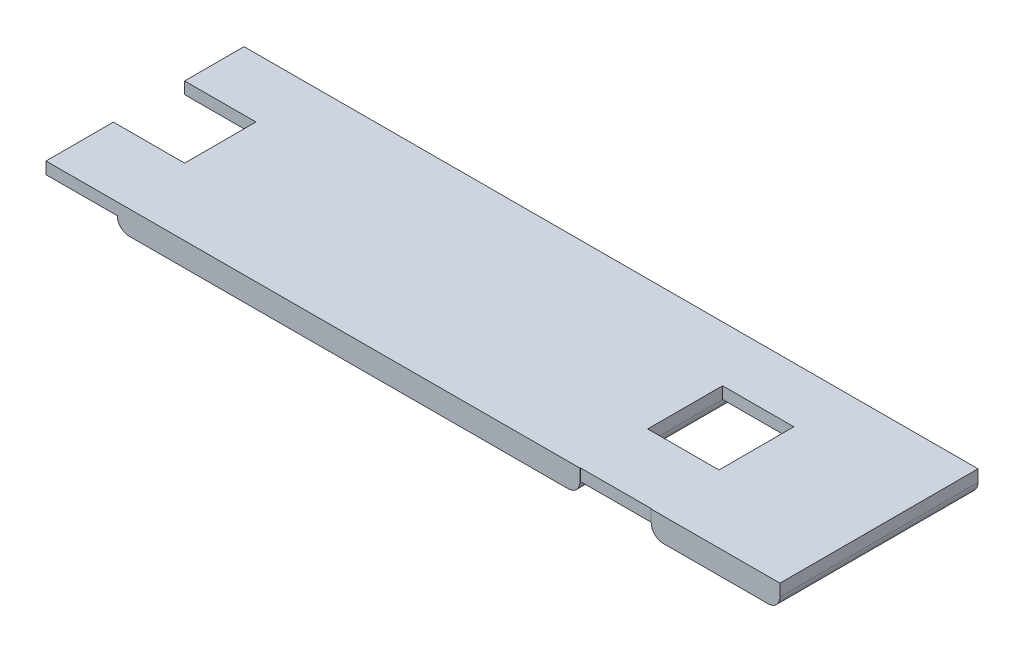
ISO-10303-21;
HEADER;
FILE_DESCRIPTION(('STEP AP214'),'2;1');
FILE_NAME('part.step','',(''),(''),'','','');
FILE_SCHEMA(('AUTOMOTIVE_DESIGN { 1 0 10303 214 1 1 1 1 }'));
ENDSEC;
DATA;
#1=APPLICATION_CONTEXT('core data for automotive mechanical design processes');
#2=APPLICATION_PROTOCOL_DEFINITION('international standard','automotive_design',2000,#1);
#3=PRODUCT_CONTEXT('',#1,'mechanical');
#4=PRODUCT('Part','Part','',(#3));
#5=PRODUCT_RELATED_PRODUCT_CATEGORY('part','',(#4));
#6=PRODUCT_DEFINITION_FORMATION('','',#4);
#7=PRODUCT_DEFINITION_CONTEXT('part definition',#1,'design');
#8=PRODUCT_DEFINITION('design','',#6,#7);
#9=PRODUCT_DEFINITION_SHAPE('','',#8);
#10=(LENGTH_UNIT() NAMED_UNIT(*) SI_UNIT(.MILLI.,.METRE.));
#11=(NAMED_UNIT(*) PLANE_ANGLE_UNIT() SI_UNIT($,.RADIAN.));
#12=(NAMED_UNIT(*) SI_UNIT($,.STERADIAN.) SOLID_ANGLE_UNIT());
#13=UNCERTAINTY_MEASURE_WITH_UNIT(LENGTH_MEASURE(1.E-05),#10,'distance_accuracy_value','');
#14=(GEOMETRIC_REPRESENTATION_CONTEXT(3) GLOBAL_UNCERTAINTY_ASSIGNED_CONTEXT((#13)) GLOBAL_UNIT_ASSIGNED_CONTEXT((#10,
#11,#12)) REPRESENTATION_CONTEXT('',''));
#15=CARTESIAN_POINT('',(0.,0.,0.));
#16=DIRECTION('',(0.,0.,1.));
#17=DIRECTION('',(1.,0.,0.));
#18=AXIS2_PLACEMENT_3D('',#15,#16,#17);
#19=CARTESIAN_POINT('',(-142.327839016119,346.949515418537,-1950.));
#20=DIRECTION('',(0.999998224302538,0.00188451366931833,0.));
#21=DIRECTION('',(-0.00188451366931833,0.999998224302538,0.));
#22=AXIS2_PLACEMENT_3D('',#19,#20,#21);
#23=PLANE('',#22);
#24=DIRECTION('',(-0.0018845136693183,0.999998224302539,0.));
#25=VECTOR('',#24,1.);
#26=CARTESIAN_POINT('',(-142.322185475111,343.94952074563,-1985.));
#27=LINE('',#26,#25);
#28=CARTESIAN_POINT('',(-142.322185475111,343.94952074563,-1985.));
#29=VERTEX_POINT('',#28);
#30=CARTESIAN_POINT('',(-142.327839016119,346.949515418537,-1985.));
#31=VERTEX_POINT('',#30);
#32=EDGE_CURVE('E223',#29,#31,#27,.T.);
#33=ORIENTED_EDGE('',*,*,#32,.F.);
#34=DIRECTION('',(0.,0.,-1.));
#35=VECTOR('',#34,1.);
#36=CARTESIAN_POINT('',(-142.322185475111,343.94952074563,-1950.));
#37=LINE('',#36,#35);
#38=CARTESIAN_POINT('',(-142.322185475111,343.94952074563,-1967.));
#39=VERTEX_POINT('',#38);
#40=EDGE_CURVE('E274',#39,#29,#37,.T.);
#41=ORIENTED_EDGE('',*,*,#40,.F.);
#42=DIRECTION('',(0.0018845136693183,-0.999998224302539,0.));
#43=VECTOR('',#42,1.);
#44=CARTESIAN_POINT('',(-142.327839016119,346.949515418537,-1967.));
#45=LINE('',#44,#43);
#46=CARTESIAN_POINT('',(-142.327839016119,346.949515418537,-1967.));
#47=VERTEX_POINT('',#46);
#48=EDGE_CURVE('E227',#47,#39,#45,.T.);
#49=ORIENTED_EDGE('',*,*,#48,.F.);
#50=DIRECTION('',(0.,0.,-1.));
#51=VECTOR('',#50,1.);
#52=CARTESIAN_POINT('',(-142.327839016119,346.949515418537,-1950.));
#53=LINE('',#52,#51);
#54=EDGE_CURVE('E271',#47,#31,#53,.T.);
#55=ORIENTED_EDGE('',*,*,#54,.T.);
#56=EDGE_LOOP('',(#33,#41,#49,#55));
#57=FACE_BOUND('',#56,.T.);
#58=ADVANCED_FACE('F41',(#57),#23,.F.);
#59=CARTESIAN_POINT('',(-7.53315528742021,347.203538293643,-1950.));
#60=DIRECTION('',(0.999998224302538,0.00188451366931833,0.));
#61=DIRECTION('',(-0.00188451366931833,0.999998224302538,0.));
#62=AXIS2_PLACEMENT_3D('',#59,#60,#61);
#63=PLANE('',#62);
#64=DIRECTION('',(-0.00188451366931833,0.999998224302538,0.));
#65=VECTOR('',#64,1.);
#66=CARTESIAN_POINT('',(-6.87881988214074,-0.0129632531154886,-1986.));
#67=LINE('',#66,#65);
#68=CARTESIAN_POINT('',(-7.52750174641226,344.203543620735,-1986.));
#69=VERTEX_POINT('',#68);
#70=CARTESIAN_POINT('',(-7.53315528742021,347.203538293643,-1986.));
#71=VERTEX_POINT('',#70);
#72=EDGE_CURVE('E61',#69,#71,#67,.T.);
#73=ORIENTED_EDGE('',*,*,#72,.F.);
#74=DIRECTION('',(0.,0.,-1.));
#75=VECTOR('',#74,1.);
#76=CARTESIAN_POINT('',(-7.52750174641226,344.203543620735,-1950.));
#77=LINE('',#76,#75);
#78=CARTESIAN_POINT('',(-7.52750174641226,344.203543620735,-1967.11298419882));
#79=VERTEX_POINT('',#78);
#80=EDGE_CURVE('E356',#79,#69,#77,.T.);
#81=ORIENTED_EDGE('',*,*,#80,.F.);
#82=DIRECTION('',(0.00188451366931833,-0.999998224302538,0.));
#83=VECTOR('',#82,1.);
#84=CARTESIAN_POINT('',(-6.87881988214074,-0.0129632531154886,-1967.11298419882));
#85=LINE('',#84,#83);
#86=CARTESIAN_POINT('',(-7.53315528742021,347.203538293643,-1967.11298419882));
#87=VERTEX_POINT('',#86);
#88=EDGE_CURVE('E311',#87,#79,#85,.T.);
#89=ORIENTED_EDGE('',*,*,#88,.F.);
#90=DIRECTION('',(0.,0.,-1.));
#91=VECTOR('',#90,1.);
#92=CARTESIAN_POINT('',(-7.53315528742021,347.203538293643,-1950.));
#93=LINE('',#92,#91);
#94=EDGE_CURVE('E56',#87,#71,#93,.T.);
#95=ORIENTED_EDGE('',*,*,#94,.T.);
#96=EDGE_LOOP('',(#73,#81,#89,#95));
#97=FACE_BOUND('',#96,.T.);
#98=ADVANCED_FACE('F408',(#97),#63,.F.);
#99=CARTESIAN_POINT('',(-25.5274697838579,344.169622374687,-1950.));
#100=DIRECTION('',(-0.999998224302538,-0.00188451366931833,0.));
#101=DIRECTION('',(0.00188451366931833,-0.999998224302538,0.));
#102=AXIS2_PLACEMENT_3D('',#99,#100,#101);
#103=PLANE('',#102);
#104=DIRECTION('',(-0.00188451366931833,0.999998224302538,0.));
#105=VECTOR('',#104,1.);
#106=CARTESIAN_POINT('',(-24.8787879195864,-0.0468844991632185,-1986.));
#107=LINE('',#106,#105);
#108=CARTESIAN_POINT('',(-25.5274697838579,344.169622374687,-1986.));
#109=VERTEX_POINT('',#108);
#110=CARTESIAN_POINT('',(-25.5331233248659,347.169617047595,-1986.));
#111=VERTEX_POINT('',#110);
#112=EDGE_CURVE('E254',#109,#111,#107,.T.);
#113=ORIENTED_EDGE('',*,*,#112,.T.);
#114=DIRECTION('',(0.,0.,-1.));
#115=VECTOR('',#114,1.);
#116=CARTESIAN_POINT('',(-25.5331233248659,347.169617047595,-1950.));
#117=LINE('',#116,#115);
#118=CARTESIAN_POINT('',(-25.5331233248659,347.169617047595,-1967.11298419882));
#119=VERTEX_POINT('',#118);
#120=EDGE_CURVE('E267',#119,#111,#117,.T.);
#121=ORIENTED_EDGE('',*,*,#120,.F.);
#122=DIRECTION('',(0.00188451366931833,-0.999998224302538,0.));
#123=VECTOR('',#122,1.);
#124=CARTESIAN_POINT('',(-24.8787879195864,-0.0468844991632185,-1967.11298419882));
#125=LINE('',#124,#123);
#126=CARTESIAN_POINT('',(-25.5274697838579,344.169622374687,-1967.11298419882));
#127=VERTEX_POINT('',#126);
#128=EDGE_CURVE('E291',#119,#127,#125,.T.);
#129=ORIENTED_EDGE('',*,*,#128,.T.);
#130=DIRECTION('',(0.,0.,-1.));
#131=VECTOR('',#130,1.);
#132=CARTESIAN_POINT('',(-25.5274697838579,344.169622374687,-1950.));
#133=LINE('',#132,#131);
#134=EDGE_CURVE('E256',#127,#109,#133,.T.);
#135=ORIENTED_EDGE('',*,*,#134,.T.);
#136=EDGE_LOOP('',(#113,#121,#129,#135));
#137=FACE_BOUND('',#136,.T.);
#138=ADVANCED_FACE('F396',(#137),#103,.F.);
#139=CARTESIAN_POINT('',(21.9667870024124,344.259126109747,-1950.));
#140=DIRECTION('',(0.,0.,-1.));
#141=DIRECTION('',(-1.,0.,0.));
#142=AXIS2_PLACEMENT_3D('',#139,#140,#141);
#143=CYLINDRICAL_SURFACE('',#142,3.00000000000001);
#144=CARTESIAN_POINT('',(21.9667870024124,344.259126109747,-2000.));
#145=DIRECTION('',(0.,0.,1.));
#146=DIRECTION('',(1.,0.,0.));
#147=AXIS2_PLACEMENT_3D('',#144,#145,#146);
#148=CIRCLE('',#147,3.00000000000001);
#149=CARTESIAN_POINT('',(21.9724405434203,341.259131436839,-2000.));
#150=VERTEX_POINT('',#149);
#151=CARTESIAN_POINT('',(24.9667870024124,344.259126109747,-2000.));
#152=VERTEX_POINT('',#151);
#153=EDGE_CURVE('E326',#150,#152,#148,.T.);
#154=ORIENTED_EDGE('',*,*,#153,.T.);
#155=DIRECTION('',(0.,0.,-1.));
#156=VECTOR('',#155,1.);
#157=CARTESIAN_POINT('',(24.9667870024124,344.259126109747,-1950.));
#158=LINE('',#157,#156);
#159=CARTESIAN_POINT('',(24.9667870024124,344.259126109747,-1950.));
#160=VERTEX_POINT('',#159);
#161=EDGE_CURVE('E11',#160,#152,#158,.T.);
#162=ORIENTED_EDGE('',*,*,#161,.F.);
#163=CARTESIAN_POINT('',(21.9667870024124,344.259126109747,-1950.));
#164=DIRECTION('',(0.,0.,1.));
#165=DIRECTION('',(1.,0.,0.));
#166=AXIS2_PLACEMENT_3D('',#163,#164,#165);
#167=CIRCLE('',#166,3.00000000000001);
#168=CARTESIAN_POINT('',(21.9724405434203,341.259131436839,-1950.));
#169=VERTEX_POINT('',#168);
#170=EDGE_CURVE('E327',#169,#160,#167,.T.);
#171=ORIENTED_EDGE('',*,*,#170,.F.);
#172=DIRECTION('',(0.,0.,-1.));
#173=VECTOR('',#172,1.);
#174=CARTESIAN_POINT('',(21.9724405434203,341.259131436839,-1950.));
#175=LINE('',#174,#173);
#176=EDGE_CURVE('E341',#169,#150,#175,.T.);
#177=ORIENTED_EDGE('',*,*,#176,.T.);
#178=EDGE_LOOP('',(#154,#162,#171,#177));
#179=FACE_BOUND('',#178,.T.);
#180=ADVANCED_FACE('F43',(#179),#143,.T.);
#181=CARTESIAN_POINT('',(24.9667870024124,344.259126109747,-1950.));
#182=DIRECTION('',(-1.,0.,0.));
#183=DIRECTION('',(0.,0.,1.));
#184=AXIS2_PLACEMENT_3D('',#181,#182,#183);
#185=PLANE('',#184);
#186=DIRECTION('',(0.,1.,0.));
#187=VECTOR('',#186,1.);
#188=CARTESIAN_POINT('',(24.9667870024124,344.259126109747,-2000.));
#189=LINE('',#188,#187);
#190=CARTESIAN_POINT('',(24.9667870024124,347.264784987896,-2000.));
#191=VERTEX_POINT('',#190);
#192=EDGE_CURVE('E344',#152,#191,#189,.T.);
#193=ORIENTED_EDGE('',*,*,#192,.T.);
#194=DIRECTION('',(0.,0.,-1.));
#195=VECTOR('',#194,1.);
#196=CARTESIAN_POINT('',(24.9667870024124,347.264784987896,-1950.));
#197=LINE('',#196,#195);
#198=CARTESIAN_POINT('',(24.9667870024124,347.264784987896,-1950.));
#199=VERTEX_POINT('',#198);
#200=EDGE_CURVE('E49',#199,#191,#197,.T.);
#201=ORIENTED_EDGE('',*,*,#200,.F.);
#202=DIRECTION('',(0.,1.,0.));
#203=VECTOR('',#202,1.);
#204=CARTESIAN_POINT('',(24.9667870024124,344.259126109747,-1950.));
#205=LINE('',#204,#203);
#206=EDGE_CURVE('E330',#160,#199,#205,.T.);
#207=ORIENTED_EDGE('',*,*,#206,.F.);
#208=ORIENTED_EDGE('',*,*,#161,.T.);
#209=EDGE_LOOP('',(#193,#201,#207,#208));
#210=FACE_BOUND('',#209,.T.);
#211=ADVANCED_FACE('F372',(#210),#185,.F.);
#212=CARTESIAN_POINT('',(24.9667870024124,347.264784987896,-1950.));
#213=DIRECTION('',(0.00188451366931463,-0.999998224302538,0.));
#214=DIRECTION('',(0.999998224302538,0.00188451366931463,0.));
#215=AXIS2_PLACEMENT_3D('',#212,#213,#214);
#216=PLANE('',#215);
#217=DIRECTION('',(-0.999998224302538,-0.00188451366931463,0.));
#218=VECTOR('',#217,1.);
#219=CARTESIAN_POINT('',(24.9667870024124,347.264784987896,-2000.));
#220=LINE('',#219,#218);
#221=CARTESIAN_POINT('',(-160.327807053565,346.915594172489,-2000.));
#222=VERTEX_POINT('',#221);
#223=EDGE_CURVE('E346',#191,#222,#220,.T.);
#224=ORIENTED_EDGE('',*,*,#223,.T.);
#225=DIRECTION('',(0.,0.,-1.));
#226=VECTOR('',#225,1.);
#227=CARTESIAN_POINT('',(-160.327807053565,346.915594172489,-2000.));
#228=LINE('',#227,#226);
#229=CARTESIAN_POINT('',(-160.327807053565,346.915594172489,-1985.));
#230=VERTEX_POINT('',#229);
#231=EDGE_CURVE('E197',#230,#222,#228,.T.);
#232=ORIENTED_EDGE('',*,*,#231,.F.);
#233=DIRECTION('',(0.999998224302539,0.00188451366931833,0.));
#234=VECTOR('',#233,1.);
#235=CARTESIAN_POINT('',(-177.590452901906,346.883062422653,-1985.));
#236=LINE('',#235,#234);
#237=EDGE_CURVE('E217',#230,#31,#236,.T.);
#238=ORIENTED_EDGE('',*,*,#237,.T.);
#239=ORIENTED_EDGE('',*,*,#54,.F.);
#240=DIRECTION('',(0.999998224302539,0.00188451366931833,0.));
#241=VECTOR('',#240,1.);
#242=CARTESIAN_POINT('',(-177.590452901906,346.883062422653,-1967.));
#243=LINE('',#242,#241);
#244=CARTESIAN_POINT('',(-160.327807053565,346.915594172489,-1967.));
#245=VERTEX_POINT('',#244);
#246=EDGE_CURVE('E232',#245,#47,#243,.T.);
#247=ORIENTED_EDGE('',*,*,#246,.F.);
#248=DIRECTION('',(0.,0.,-1.));
#249=VECTOR('',#248,1.);
#250=CARTESIAN_POINT('',(-160.327807053565,346.915594172489,-1950.));
#251=LINE('',#250,#249);
#252=CARTESIAN_POINT('',(-160.327807053565,346.915594172489,-1950.));
#253=VERTEX_POINT('',#252);
#254=EDGE_CURVE('E231',#253,#245,#251,.T.);
#255=ORIENTED_EDGE('',*,*,#254,.F.);
#256=DIRECTION('',(-0.999998224302539,-0.00188451366931599,0.));
#257=VECTOR('',#256,1.);
#258=CARTESIAN_POINT('',(-25.5331233248659,347.169617047595,-1950.));
#259=LINE('',#258,#257);
#260=CARTESIAN_POINT('',(-25.5331233248659,347.169617047595,-1950.));
#261=VERTEX_POINT('',#260);
#262=EDGE_CURVE('E295',#261,#253,#259,.T.);
#263=ORIENTED_EDGE('',*,*,#262,.F.);
#264=CARTESIAN_POINT('',(-25.5331233248659,347.169617047595,-1950.11298419882));
#265=VERTEX_POINT('',#264);
#266=EDGE_CURVE('E268',#261,#265,#117,.T.);
#267=ORIENTED_EDGE('',*,*,#266,.T.);
#268=DIRECTION('',(0.999998224302539,0.00188451366931833,0.));
#269=VECTOR('',#268,1.);
#270=CARTESIAN_POINT('',(-42.795769173207,347.137085297759,-1950.11298419882));
#271=LINE('',#270,#269);
#272=CARTESIAN_POINT('',(-7.53315528742021,347.203538293643,-1950.11298419882));
#273=VERTEX_POINT('',#272);
#274=EDGE_CURVE('E313',#265,#273,#271,.T.);
#275=ORIENTED_EDGE('',*,*,#274,.T.);
#276=CARTESIAN_POINT('',(-7.53315528742021,347.203538293643,-1950.));
#277=VERTEX_POINT('',#276);
#278=EDGE_CURVE('E360',#277,#273,#93,.T.);
#279=ORIENTED_EDGE('',*,*,#278,.F.);
#280=DIRECTION('',(-0.999998224302538,-0.00188451366931463,0.));
#281=VECTOR('',#280,1.);
#282=CARTESIAN_POINT('',(24.9667870024124,347.264784987896,-1950.));
#283=LINE('',#282,#281);
#284=EDGE_CURVE('E333',#199,#277,#283,.T.);
#285=ORIENTED_EDGE('',*,*,#284,.F.);
#286=ORIENTED_EDGE('',*,*,#200,.T.);
#287=EDGE_LOOP('',(#224,#232,#238,#239,#247,#255,#263,#267,#275,#279,#285,#286));
#288=FACE_BOUND('',#287,.T.);
#289=DIRECTION('',(0.999998224302539,0.00188451366931833,0.));
#290=VECTOR('',#289,1.);
#291=CARTESIAN_POINT('',(-42.795769173207,347.137085297759,-1986.));
#292=LINE('',#291,#290);
#293=EDGE_CURVE('E249',#111,#71,#292,.T.);
#294=ORIENTED_EDGE('',*,*,#293,.T.);
#295=ORIENTED_EDGE('',*,*,#94,.F.);
#296=DIRECTION('',(0.999998224302539,0.00188451366931833,0.));
#297=VECTOR('',#296,1.);
#298=CARTESIAN_POINT('',(-42.795769173207,347.137085297759,-1967.11298419882));
#299=LINE('',#298,#297);
#300=EDGE_CURVE('E309',#119,#87,#299,.T.);
#301=ORIENTED_EDGE('',*,*,#300,.F.);
#302=ORIENTED_EDGE('',*,*,#120,.T.);
#303=EDGE_LOOP('',(#294,#295,#301,#302));
#304=FACE_BOUND('',#303,.T.);
#305=ADVANCED_FACE('F366',(#288,#304),#216,.F.);
#306=ORIENTED_EDGE('',*,*,#278,.T.);
#307=DIRECTION('',(0.00188451366931833,-0.999998224302538,0.));
#308=VECTOR('',#307,1.);
#309=CARTESIAN_POINT('',(-6.87881988214074,-0.0129632531154886,-1950.11298419882));
#310=LINE('',#309,#308);
#311=CARTESIAN_POINT('',(-7.52750174641226,344.203543620735,-1950.11298419882));
#312=VERTEX_POINT('',#311);
#313=EDGE_CURVE('E301',#273,#312,#310,.T.);
#314=ORIENTED_EDGE('',*,*,#313,.T.);
#315=CARTESIAN_POINT('',(-7.52750174641226,344.203543620735,-1950.));
#316=VERTEX_POINT('',#315);
#317=EDGE_CURVE('E357',#316,#312,#77,.T.);
#318=ORIENTED_EDGE('',*,*,#317,.F.);
#319=DIRECTION('',(0.00188451366931833,-0.999998224302538,0.));
#320=VECTOR('',#319,1.);
#321=CARTESIAN_POINT('',(-7.53315528742021,347.203538293643,-1950.));
#322=LINE('',#321,#320);
#323=EDGE_CURVE('E335',#277,#316,#322,.T.);
#324=ORIENTED_EDGE('',*,*,#323,.F.);
#325=EDGE_LOOP('',(#306,#314,#318,#324));
#326=FACE_BOUND('',#325,.T.);
#327=ADVANCED_FACE('F413',(#326),#63,.F.);
#328=CARTESIAN_POINT('',(-4.52750707350463,344.209197161743,-1950.));
#329=DIRECTION('',(0.,0.,-1.));
#330=DIRECTION('',(-1.,0.,0.));
#331=AXIS2_PLACEMENT_3D('',#328,#329,#330);
#332=CYLINDRICAL_SURFACE('',#331,3.00000000000001);
#333=CARTESIAN_POINT('',(-4.52750707350463,344.209197161743,-2000.));
#334=DIRECTION('',(0.,0.,1.));
#335=DIRECTION('',(1.,0.,0.));
#336=AXIS2_PLACEMENT_3D('',#333,#334,#335);
#337=CIRCLE('',#336,3.00000000000001);
#338=CARTESIAN_POINT('',(-7.52750174641226,344.203543620735,-2000.));
#339=VERTEX_POINT('',#338);
#340=CARTESIAN_POINT('',(-4.52185353249668,341.209202488836,-2000.));
#341=VERTEX_POINT('',#340);
#342=EDGE_CURVE('E348',#339,#341,#337,.T.);
#343=ORIENTED_EDGE('',*,*,#342,.T.);
#344=DIRECTION('',(0.,0.,-1.));
#345=VECTOR('',#344,1.);
#346=CARTESIAN_POINT('',(-4.52185353249668,341.209202488836,-1950.));
#347=LINE('',#346,#345);
#348=CARTESIAN_POINT('',(-4.52185353249668,341.209202488836,-1950.));
#349=VERTEX_POINT('',#348);
#350=EDGE_CURVE('E353',#349,#341,#347,.T.);
#351=ORIENTED_EDGE('',*,*,#350,.F.);
#352=CARTESIAN_POINT('',(-4.52750707350463,344.209197161743,-1950.));
#353=DIRECTION('',(0.,0.,1.));
#354=DIRECTION('',(1.,0.,0.));
#355=AXIS2_PLACEMENT_3D('',#352,#353,#354);
#356=CIRCLE('',#355,3.00000000000001);
#357=EDGE_CURVE('E337',#316,#349,#356,.T.);
#358=ORIENTED_EDGE('',*,*,#357,.F.);
#359=ORIENTED_EDGE('',*,*,#317,.T.);
#360=DIRECTION('',(0.,0.,1.));
#361=VECTOR('',#360,1.);
#362=CARTESIAN_POINT('',(-7.52750174641227,344.203543620735,0.));
#363=LINE('',#362,#361);
#364=EDGE_CURVE('E306',#79,#312,#363,.T.);
#365=ORIENTED_EDGE('',*,*,#364,.F.);
#366=ORIENTED_EDGE('',*,*,#80,.T.);
#367=DIRECTION('',(0.,0.,1.));
#368=VECTOR('',#367,1.);
#369=CARTESIAN_POINT('',(-7.52750174641227,344.203543620735,0.));
#370=LINE('',#369,#368);
#371=EDGE_CURVE('E251',#339,#69,#370,.T.);
#372=ORIENTED_EDGE('',*,*,#371,.F.);
#373=EDGE_LOOP('',(#343,#351,#358,#359,#365,#366,#372));
#374=FACE_BOUND('',#373,.T.);
#375=ADVANCED_FACE('F385',(#374),#332,.T.);
#376=CARTESIAN_POINT('',(-4.52185353249668,341.209202488836,-1950.));
#377=DIRECTION('',(-0.00188451366931401,0.999998224302538,0.));
#378=DIRECTION('',(-0.999998224302538,-0.00188451366931401,0.));
#379=AXIS2_PLACEMENT_3D('',#376,#377,#378);
#380=PLANE('',#379);
#381=DIRECTION('',(0.999998224302538,0.00188451366931401,0.));
#382=VECTOR('',#381,1.);
#383=CARTESIAN_POINT('',(-4.52185353249668,341.209202488836,-2000.));
#384=LINE('',#383,#382);
#385=EDGE_CURVE('E331',#341,#150,#384,.T.);
#386=ORIENTED_EDGE('',*,*,#385,.T.);
#387=ORIENTED_EDGE('',*,*,#176,.F.);
#388=DIRECTION('',(0.999998224302538,0.00188451366931401,0.));
#389=VECTOR('',#388,1.);
#390=CARTESIAN_POINT('',(-4.52185353249668,341.209202488836,-1950.));
#391=LINE('',#390,#389);
#392=EDGE_CURVE('E339',#349,#169,#391,.T.);
#393=ORIENTED_EDGE('',*,*,#392,.F.);
#394=ORIENTED_EDGE('',*,*,#350,.T.);
#395=EDGE_LOOP('',(#386,#387,#393,#394));
#396=FACE_BOUND('',#395,.T.);
#397=ADVANCED_FACE('F378',(#396),#380,.F.);
#398=CARTESIAN_POINT('',(21.9667870024124,344.259126109747,-1950.));
#399=DIRECTION('',(0.,0.,1.));
#400=DIRECTION('',(1.,0.,0.));
#401=AXIS2_PLACEMENT_3D('',#398,#399,#400);
#402=PLANE('',#401);
#403=ORIENTED_EDGE('',*,*,#170,.T.);
#404=ORIENTED_EDGE('',*,*,#206,.T.);
#405=ORIENTED_EDGE('',*,*,#284,.T.);
#406=ORIENTED_EDGE('',*,*,#323,.T.);
#407=ORIENTED_EDGE('',*,*,#357,.T.);
#408=ORIENTED_EDGE('',*,*,#392,.T.);
#409=EDGE_LOOP('',(#403,#404,#405,#406,#407,#408));
#410=FACE_BOUND('',#409,.T.);
#411=ADVANCED_FACE('F487',(#410),#402,.T.);
#412=CARTESIAN_POINT('',(21.9667870024124,344.259126109747,-2000.));
#413=DIRECTION('',(0.,0.,1.));
#414=DIRECTION('',(1.,0.,0.));
#415=AXIS2_PLACEMENT_3D('',#412,#413,#414);
#416=PLANE('',#415);
#417=ORIENTED_EDGE('',*,*,#153,.F.);
#418=ORIENTED_EDGE('',*,*,#385,.F.);
#419=ORIENTED_EDGE('',*,*,#342,.F.);
#420=DIRECTION('',(0.999998224302539,0.00188451366931833,0.));
#421=VECTOR('',#420,1.);
#422=CARTESIAN_POINT('',(-42.7901156321991,344.137090624851,-2000.));
#423=LINE('',#422,#421);
#424=CARTESIAN_POINT('',(-25.5274697838579,344.169622374687,-2000.));
#425=VERTEX_POINT('',#424);
#426=EDGE_CURVE('E247',#425,#339,#423,.T.);
#427=ORIENTED_EDGE('',*,*,#426,.F.);
#428=CARTESIAN_POINT('',(-28.5274644567656,344.16396883368,-2000.));
#429=DIRECTION('',(0.,0.,1.));
#430=DIRECTION('',(1.,0.,0.));
#431=AXIS2_PLACEMENT_3D('',#428,#429,#430);
#432=CIRCLE('',#431,3.00000000000001);
#433=CARTESIAN_POINT('',(-28.5218109157576,341.163974160772,-2000.));
#434=VERTEX_POINT('',#433);
#435=EDGE_CURVE('E289',#434,#425,#432,.T.);
#436=ORIENTED_EDGE('',*,*,#435,.F.);
#437=DIRECTION('',(0.999998224302538,0.00188451366931586,0.));
#438=VECTOR('',#437,1.);
#439=CARTESIAN_POINT('',(-139.316537261196,340.95517961373,-2000.));
#440=LINE('',#439,#438);
#441=CARTESIAN_POINT('',(-139.316537261196,340.95517961373,-2000.));
#442=VERTEX_POINT('',#441);
#443=EDGE_CURVE('E285',#442,#434,#440,.T.);
#444=ORIENTED_EDGE('',*,*,#443,.F.);
#445=CARTESIAN_POINT('',(-139.322190802203,343.955174286638,-2000.));
#446=DIRECTION('',(0.,0.,1.));
#447=DIRECTION('',(1.,0.,0.));
#448=AXIS2_PLACEMENT_3D('',#445,#446,#447);
#449=CIRCLE('',#448,3.00000000000001);
#450=CARTESIAN_POINT('',(-142.322185475111,343.94952074563,-2000.));
#451=VERTEX_POINT('',#450);
#452=EDGE_CURVE('E215',#451,#442,#449,.T.);
#453=ORIENTED_EDGE('',*,*,#452,.F.);
#454=DIRECTION('',(0.999998224302539,0.00188451366931833,0.));
#455=VECTOR('',#454,1.);
#456=CARTESIAN_POINT('',(-177.584799360898,343.883067749745,-2000.));
#457=LINE('',#456,#455);
#458=CARTESIAN_POINT('',(-160.322153512557,343.915599499582,-2000.));
#459=VERTEX_POINT('',#458);
#460=EDGE_CURVE('E206',#459,#451,#457,.T.);
#461=ORIENTED_EDGE('',*,*,#460,.F.);
#462=DIRECTION('',(0.00188451366931581,-0.999998224302539,0.));
#463=VECTOR('',#462,1.);
#464=CARTESIAN_POINT('',(-160.322153512557,343.915599499582,-2000.));
#465=LINE('',#464,#463);
#466=EDGE_CURVE('E191',#222,#459,#465,.T.);
#467=ORIENTED_EDGE('',*,*,#466,.F.);
#468=ORIENTED_EDGE('',*,*,#223,.F.);
#469=ORIENTED_EDGE('',*,*,#192,.F.);
#470=EDGE_LOOP('',(#417,#418,#419,#427,#436,#444,#453,#461,#467,#468,#469));
#471=FACE_BOUND('',#470,.T.);
#472=ADVANCED_FACE('F213',(#471),#416,.F.);
#473=CARTESIAN_POINT('',(-42.1414337679276,-0.0794162489995643,-1950.11298419882));
#474=DIRECTION('',(0.,0.,1.));
#475=DIRECTION('',(1.,0.,0.));
#476=AXIS2_PLACEMENT_3D('',#473,#474,#475);
#477=PLANE('',#476);
#478=ORIENTED_EDGE('',*,*,#274,.F.);
#479=DIRECTION('',(0.00188451366931833,-0.999998224302538,0.));
#480=VECTOR('',#479,1.);
#481=CARTESIAN_POINT('',(-24.8787879195864,-0.0468844991632185,-1950.11298419882));
#482=LINE('',#481,#480);
#483=CARTESIAN_POINT('',(-25.5274697838579,344.169622374687,-1950.11298419882));
#484=VERTEX_POINT('',#483);
#485=EDGE_CURVE('E304',#265,#484,#482,.T.);
#486=ORIENTED_EDGE('',*,*,#485,.T.);
#487=DIRECTION('',(0.999998224302539,0.00188451366931833,0.));
#488=VECTOR('',#487,1.);
#489=CARTESIAN_POINT('',(-42.7901156321991,344.137090624851,-1950.11298419882));
#490=LINE('',#489,#488);
#491=EDGE_CURVE('E316',#484,#312,#490,.T.);
#492=ORIENTED_EDGE('',*,*,#491,.T.);
#493=ORIENTED_EDGE('',*,*,#313,.F.);
#494=EDGE_LOOP('',(#478,#486,#492,#493));
#495=FACE_BOUND('',#494,.T.);
#496=ADVANCED_FACE('F416',(#495),#477,.T.);
#497=CARTESIAN_POINT('',(-42.7901156321991,344.137090624851,0.));
#498=DIRECTION('',(-0.00188451366931833,0.999998224302539,0.));
#499=DIRECTION('',(-0.999998224302539,-0.00188451366931833,0.));
#500=AXIS2_PLACEMENT_3D('',#497,#498,#499);
#501=PLANE('',#500);
#502=DIRECTION('',(0.,0.,1.));
#503=VECTOR('',#502,1.);
#504=CARTESIAN_POINT('',(-25.5274697838579,344.169622374687,0.));
#505=LINE('',#504,#503);
#506=EDGE_CURVE('E305',#127,#484,#505,.T.);
#507=ORIENTED_EDGE('',*,*,#506,.F.);
#508=DIRECTION('',(0.999998224302539,0.00188451366931833,0.));
#509=VECTOR('',#508,1.);
#510=CARTESIAN_POINT('',(-42.7901156321991,344.137090624851,-1967.11298419882));
#511=LINE('',#510,#509);
#512=EDGE_CURVE('E310',#127,#79,#511,.T.);
#513=ORIENTED_EDGE('',*,*,#512,.T.);
#514=ORIENTED_EDGE('',*,*,#364,.T.);
#515=ORIENTED_EDGE('',*,*,#491,.F.);
#516=EDGE_LOOP('',(#507,#513,#514,#515));
#517=FACE_BOUND('',#516,.T.);
#518=ADVANCED_FACE('F407',(#517),#501,.F.);
#519=CARTESIAN_POINT('',(-42.1414337679276,-0.0794162489995643,-1967.11298419882));
#520=DIRECTION('',(0.,0.,1.));
#521=DIRECTION('',(1.,0.,0.));
#522=AXIS2_PLACEMENT_3D('',#519,#520,#521);
#523=PLANE('',#522);
#524=ORIENTED_EDGE('',*,*,#128,.F.);
#525=ORIENTED_EDGE('',*,*,#300,.T.);
#526=ORIENTED_EDGE('',*,*,#88,.T.);
#527=ORIENTED_EDGE('',*,*,#512,.F.);
#528=EDGE_LOOP('',(#524,#525,#526,#527));
#529=FACE_BOUND('',#528,.T.);
#530=ADVANCED_FACE('F405',(#529),#523,.F.);
#531=CARTESIAN_POINT('',(-28.5274644567656,344.16396883368,-1950.));
#532=DIRECTION('',(0.,0.,-1.));
#533=DIRECTION('',(-1.,0.,0.));
#534=AXIS2_PLACEMENT_3D('',#531,#532,#533);
#535=CYLINDRICAL_SURFACE('',#534,3.00000000000001);
#536=ORIENTED_EDGE('',*,*,#435,.T.);
#537=DIRECTION('',(0.,0.,1.));
#538=VECTOR('',#537,1.);
#539=CARTESIAN_POINT('',(-25.5274697838579,344.169622374687,0.));
#540=LINE('',#539,#538);
#541=EDGE_CURVE('E257',#425,#109,#540,.T.);
#542=ORIENTED_EDGE('',*,*,#541,.T.);
#543=ORIENTED_EDGE('',*,*,#134,.F.);
#544=ORIENTED_EDGE('',*,*,#506,.T.);
#545=CARTESIAN_POINT('',(-25.5274697838579,344.169622374687,-1950.));
#546=VERTEX_POINT('',#545);
#547=EDGE_CURVE('E264',#546,#484,#133,.T.);
#548=ORIENTED_EDGE('',*,*,#547,.F.);
#549=CARTESIAN_POINT('',(-28.5274644567656,344.16396883368,-1950.));
#550=DIRECTION('',(0.,0.,1.));
#551=DIRECTION('',(1.,0.,0.));
#552=AXIS2_PLACEMENT_3D('',#549,#550,#551);
#553=CIRCLE('',#552,3.00000000000001);
#554=CARTESIAN_POINT('',(-28.5218109157576,341.163974160772,-1950.));
#555=VERTEX_POINT('',#554);
#556=EDGE_CURVE('E287',#555,#546,#553,.T.);
#557=ORIENTED_EDGE('',*,*,#556,.F.);
#558=DIRECTION('',(0.,0.,-1.));
#559=VECTOR('',#558,1.);
#560=CARTESIAN_POINT('',(-28.5218109157576,341.163974160772,-1950.));
#561=LINE('',#560,#559);
#562=EDGE_CURVE('E281',#555,#434,#561,.T.);
#563=ORIENTED_EDGE('',*,*,#562,.T.);
#564=EDGE_LOOP('',(#536,#542,#543,#544,#548,#557,#563));
#565=FACE_BOUND('',#564,.T.);
#566=ADVANCED_FACE('F393',(#565),#535,.T.);
#567=ORIENTED_EDGE('',*,*,#485,.F.);
#568=ORIENTED_EDGE('',*,*,#266,.F.);
#569=DIRECTION('',(-0.00188451366931833,0.999998224302538,0.));
#570=VECTOR('',#569,1.);
#571=CARTESIAN_POINT('',(-25.5274697838579,344.169622374687,-1950.));
#572=LINE('',#571,#570);
#573=EDGE_CURVE('E297',#546,#261,#572,.T.);
#574=ORIENTED_EDGE('',*,*,#573,.F.);
#575=ORIENTED_EDGE('',*,*,#547,.T.);
#576=EDGE_LOOP('',(#567,#568,#574,#575));
#577=FACE_BOUND('',#576,.T.);
#578=ADVANCED_FACE('F422',(#577),#103,.F.);
#579=CARTESIAN_POINT('',(-139.322190802203,343.955174286638,-1950.));
#580=DIRECTION('',(0.,0.,-1.));
#581=DIRECTION('',(-1.,0.,0.));
#582=AXIS2_PLACEMENT_3D('',#579,#580,#581);
#583=CYLINDRICAL_SURFACE('',#582,3.00000000000001);
#584=ORIENTED_EDGE('',*,*,#452,.T.);
#585=DIRECTION('',(0.,0.,-1.));
#586=VECTOR('',#585,1.);
#587=CARTESIAN_POINT('',(-139.316537261196,340.95517961373,-1950.));
#588=LINE('',#587,#586);
#589=CARTESIAN_POINT('',(-139.316537261196,340.95517961373,-1950.));
#590=VERTEX_POINT('',#589);
#591=EDGE_CURVE('E278',#590,#442,#588,.T.);
#592=ORIENTED_EDGE('',*,*,#591,.F.);
#593=CARTESIAN_POINT('',(-139.322190802203,343.955174286638,-1950.));
#594=DIRECTION('',(0.,0.,1.));
#595=DIRECTION('',(1.,0.,0.));
#596=AXIS2_PLACEMENT_3D('',#593,#594,#595);
#597=CIRCLE('',#596,3.00000000000001);
#598=CARTESIAN_POINT('',(-142.322185475111,343.94952074563,-1950.));
#599=VERTEX_POINT('',#598);
#600=EDGE_CURVE('E293',#599,#590,#597,.T.);
#601=ORIENTED_EDGE('',*,*,#600,.F.);
#602=EDGE_CURVE('E275',#599,#39,#37,.T.);
#603=ORIENTED_EDGE('',*,*,#602,.T.);
#604=ORIENTED_EDGE('',*,*,#40,.T.);
#605=DIRECTION('',(0.,0.,1.));
#606=VECTOR('',#605,1.);
#607=CARTESIAN_POINT('',(-142.322185475111,343.94952074563,-2000.));
#608=LINE('',#607,#606);
#609=EDGE_CURVE('E226',#451,#29,#608,.T.);
#610=ORIENTED_EDGE('',*,*,#609,.F.);
#611=EDGE_LOOP('',(#584,#592,#601,#603,#604,#610));
#612=FACE_BOUND('',#611,.T.);
#613=ADVANCED_FACE('F433',(#612),#583,.T.);
#614=CARTESIAN_POINT('',(-139.316537261196,340.95517961373,-1950.));
#615=DIRECTION('',(-0.00188451366931586,0.999998224302538,0.));
#616=DIRECTION('',(-0.999998224302538,-0.00188451366931586,0.));
#617=AXIS2_PLACEMENT_3D('',#614,#615,#616);
#618=PLANE('',#617);
#619=ORIENTED_EDGE('',*,*,#443,.T.);
#620=ORIENTED_EDGE('',*,*,#562,.F.);
#621=DIRECTION('',(0.999998224302538,0.00188451366931586,0.));
#622=VECTOR('',#621,1.);
#623=CARTESIAN_POINT('',(-139.316537261196,340.95517961373,-1950.));
#624=LINE('',#623,#622);
#625=EDGE_CURVE('E284',#590,#555,#624,.T.);
#626=ORIENTED_EDGE('',*,*,#625,.F.);
#627=ORIENTED_EDGE('',*,*,#591,.T.);
#628=EDGE_LOOP('',(#619,#620,#626,#627));
#629=FACE_BOUND('',#628,.T.);
#630=ADVANCED_FACE('F429',(#629),#618,.F.);
#631=CARTESIAN_POINT('',(-28.5274644567656,344.16396883368,-1950.));
#632=DIRECTION('',(0.,0.,1.));
#633=DIRECTION('',(1.,0.,0.));
#634=AXIS2_PLACEMENT_3D('',#631,#632,#633);
#635=PLANE('',#634);
#636=ORIENTED_EDGE('',*,*,#556,.T.);
#637=ORIENTED_EDGE('',*,*,#573,.T.);
#638=ORIENTED_EDGE('',*,*,#262,.T.);
#639=DIRECTION('',(-0.00188451366931581,0.999998224302539,0.));
#640=VECTOR('',#639,1.);
#641=CARTESIAN_POINT('',(-160.327807053565,346.915594172489,-1950.));
#642=LINE('',#641,#640);
#643=CARTESIAN_POINT('',(-160.322153512557,343.915599499582,-1950.));
#644=VERTEX_POINT('',#643);
#645=EDGE_CURVE('E234',#644,#253,#642,.T.);
#646=ORIENTED_EDGE('',*,*,#645,.F.);
#647=DIRECTION('',(0.999998224302539,0.00188451366931833,0.));
#648=VECTOR('',#647,1.);
#649=CARTESIAN_POINT('',(-177.584799360898,343.883067749745,-1950.));
#650=LINE('',#649,#648);
#651=EDGE_CURVE('E240',#644,#599,#650,.T.);
#652=ORIENTED_EDGE('',*,*,#651,.T.);
#653=ORIENTED_EDGE('',*,*,#600,.T.);
#654=ORIENTED_EDGE('',*,*,#625,.T.);
#655=EDGE_LOOP('',(#636,#637,#638,#646,#652,#653,#654));
#656=FACE_BOUND('',#655,.T.);
#657=ADVANCED_FACE('F425',(#656),#635,.T.);
#658=CARTESIAN_POINT('',(-42.7901156321991,344.137090624851,0.));
#659=DIRECTION('',(-0.00188451366931833,0.999998224302539,0.));
#660=DIRECTION('',(-0.999998224302539,-0.00188451366931833,0.));
#661=AXIS2_PLACEMENT_3D('',#658,#659,#660);
#662=PLANE('',#661);
#663=ORIENTED_EDGE('',*,*,#541,.F.);
#664=ORIENTED_EDGE('',*,*,#426,.T.);
#665=ORIENTED_EDGE('',*,*,#371,.T.);
#666=DIRECTION('',(0.999998224302539,0.00188451366931833,0.));
#667=VECTOR('',#666,1.);
#668=CARTESIAN_POINT('',(-42.7901156321991,344.137090624851,-1986.));
#669=LINE('',#668,#667);
#670=EDGE_CURVE('E250',#109,#69,#669,.T.);
#671=ORIENTED_EDGE('',*,*,#670,.F.);
#672=EDGE_LOOP('',(#663,#664,#665,#671));
#673=FACE_BOUND('',#672,.T.);
#674=ADVANCED_FACE('F389',(#673),#662,.F.);
#675=CARTESIAN_POINT('',(-42.1414337679276,-0.0794162489995643,-1986.));
#676=DIRECTION('',(0.,0.,-1.));
#677=DIRECTION('',(-1.,0.,0.));
#678=AXIS2_PLACEMENT_3D('',#675,#676,#677);
#679=PLANE('',#678);
#680=ORIENTED_EDGE('',*,*,#112,.F.);
#681=ORIENTED_EDGE('',*,*,#670,.T.);
#682=ORIENTED_EDGE('',*,*,#72,.T.);
#683=ORIENTED_EDGE('',*,*,#293,.F.);
#684=EDGE_LOOP('',(#680,#681,#682,#683));
#685=FACE_BOUND('',#684,.T.);
#686=ADVANCED_FACE('F402',(#685),#679,.F.);
#687=CARTESIAN_POINT('',(-177.590452901906,346.883062422653,-1967.));
#688=DIRECTION('',(0.,0.,1.));
#689=DIRECTION('',(1.,0.,0.));
#690=AXIS2_PLACEMENT_3D('',#687,#688,#689);
#691=PLANE('',#690);
#692=DIRECTION('',(0.00188451366931581,-0.999998224302539,0.));
#693=VECTOR('',#692,1.);
#694=CARTESIAN_POINT('',(-160.327807053565,346.915594172489,-1967.));
#695=LINE('',#694,#693);
#696=CARTESIAN_POINT('',(-160.322153512557,343.915599499582,-1967.));
#697=VERTEX_POINT('',#696);
#698=EDGE_CURVE('E229',#245,#697,#695,.T.);
#699=ORIENTED_EDGE('',*,*,#698,.F.);
#700=ORIENTED_EDGE('',*,*,#246,.T.);
#701=ORIENTED_EDGE('',*,*,#48,.T.);
#702=DIRECTION('',(0.999998224302539,0.00188451366931833,0.));
#703=VECTOR('',#702,1.);
#704=CARTESIAN_POINT('',(-177.584799360898,343.883067749745,-1967.));
#705=LINE('',#704,#703);
#706=EDGE_CURVE('E243',#697,#39,#705,.T.);
#707=ORIENTED_EDGE('',*,*,#706,.F.);
#708=EDGE_LOOP('',(#699,#700,#701,#707));
#709=FACE_BOUND('',#708,.T.);
#710=ADVANCED_FACE('F447',(#709),#691,.F.);
#711=CARTESIAN_POINT('',(-177.584799360898,343.883067749745,-1950.));
#712=DIRECTION('',(-0.00188451366931833,0.999998224302539,0.));
#713=DIRECTION('',(-0.999998224302539,-0.00188451366931833,0.));
#714=AXIS2_PLACEMENT_3D('',#711,#712,#713);
#715=PLANE('',#714);
#716=DIRECTION('',(0.,0.,1.));
#717=VECTOR('',#716,1.);
#718=CARTESIAN_POINT('',(-160.322153512557,343.915599499582,-1950.));
#719=LINE('',#718,#717);
#720=EDGE_CURVE('E237',#697,#644,#719,.T.);
#721=ORIENTED_EDGE('',*,*,#720,.F.);
#722=ORIENTED_EDGE('',*,*,#706,.T.);
#723=ORIENTED_EDGE('',*,*,#602,.F.);
#724=ORIENTED_EDGE('',*,*,#651,.F.);
#725=EDGE_LOOP('',(#721,#722,#723,#724));
#726=FACE_BOUND('',#725,.T.);
#727=ADVANCED_FACE('F455',(#726),#715,.F.);
#728=CARTESIAN_POINT('',(-159.552523431166,-64.4808622993229,-1949.96));
#729=DIRECTION('',(-0.999998224302539,-0.00188451366931581,0.));
#730=DIRECTION('',(0.,0.,1.));
#731=AXIS2_PLACEMENT_3D('',#728,#729,#730);
#732=PLANE('',#731);
#733=ORIENTED_EDGE('',*,*,#645,.T.);
#734=ORIENTED_EDGE('',*,*,#254,.T.);
#735=ORIENTED_EDGE('',*,*,#698,.T.);
#736=ORIENTED_EDGE('',*,*,#720,.T.);
#737=EDGE_LOOP('',(#733,#734,#735,#736));
#738=FACE_BOUND('',#737,.T.);
#739=ADVANCED_FACE('F451',(#738),#732,.T.);
#740=CARTESIAN_POINT('',(-177.584799360898,343.883067749745,-2000.));
#741=DIRECTION('',(-0.00188451366931833,0.999998224302539,0.));
#742=DIRECTION('',(-0.999998224302539,-0.00188451366931833,0.));
#743=AXIS2_PLACEMENT_3D('',#740,#741,#742);
#744=PLANE('',#743);
#745=DIRECTION('',(0.,0.,1.));
#746=VECTOR('',#745,1.);
#747=CARTESIAN_POINT('',(-160.322153512557,343.915599499582,-2000.));
#748=LINE('',#747,#746);
#749=CARTESIAN_POINT('',(-160.322153512557,343.915599499582,-1985.));
#750=VERTEX_POINT('',#749);
#751=EDGE_CURVE('E194',#459,#750,#748,.T.);
#752=ORIENTED_EDGE('',*,*,#751,.F.);
#753=ORIENTED_EDGE('',*,*,#460,.T.);
#754=ORIENTED_EDGE('',*,*,#609,.T.);
#755=DIRECTION('',(0.999998224302539,0.00188451366931833,0.));
#756=VECTOR('',#755,1.);
#757=CARTESIAN_POINT('',(-177.584799360898,343.883067749745,-1985.));
#758=LINE('',#757,#756);
#759=EDGE_CURVE('E208',#750,#29,#758,.T.);
#760=ORIENTED_EDGE('',*,*,#759,.F.);
#761=EDGE_LOOP('',(#752,#753,#754,#760));
#762=FACE_BOUND('',#761,.T.);
#763=ADVANCED_FACE('F204',(#762),#744,.F.);
#764=CARTESIAN_POINT('',(-177.584799360898,343.883067749745,-1985.));
#765=DIRECTION('',(0.,0.,-1.));
#766=DIRECTION('',(-1.,0.,0.));
#767=AXIS2_PLACEMENT_3D('',#764,#765,#766);
#768=PLANE('',#767);
#769=DIRECTION('',(-0.00188451366931581,0.999998224302539,0.));
#770=VECTOR('',#769,1.);
#771=CARTESIAN_POINT('',(-160.322153512557,343.915599499582,-1985.));
#772=LINE('',#771,#770);
#773=EDGE_CURVE('E209',#750,#230,#772,.T.);
#774=ORIENTED_EDGE('',*,*,#773,.F.);
#775=ORIENTED_EDGE('',*,*,#759,.T.);
#776=ORIENTED_EDGE('',*,*,#32,.T.);
#777=ORIENTED_EDGE('',*,*,#237,.F.);
#778=EDGE_LOOP('',(#774,#775,#776,#777));
#779=FACE_BOUND('',#778,.T.);
#780=ADVANCED_FACE('F442',(#779),#768,.F.);
#781=CARTESIAN_POINT('',(-159.552523431166,-64.4808622993229,-1949.96));
#782=DIRECTION('',(-0.999998224302539,-0.00188451366931581,0.));
#783=DIRECTION('',(0.,0.,1.));
#784=AXIS2_PLACEMENT_3D('',#781,#782,#783);
#785=PLANE('',#784);
#786=ORIENTED_EDGE('',*,*,#466,.T.);
#787=ORIENTED_EDGE('',*,*,#751,.T.);
#788=ORIENTED_EDGE('',*,*,#773,.T.);
#789=ORIENTED_EDGE('',*,*,#231,.T.);
#790=EDGE_LOOP('',(#786,#787,#788,#789));
#791=FACE_BOUND('',#790,.T.);
#792=ADVANCED_FACE('F193',(#791),#785,.T.);
#793=CLOSED_SHELL('',(#58,#98,#138,#180,#211,#305,#327,#375,#397,#411,#472,#496,#518,#530,#566,
#578,#613,#630,#657,#674,#686,#710,#727,#739,#763,#780,#792));
#794=MANIFOLD_SOLID_BREP('B2',#793);
#795=ADVANCED_BREP_SHAPE_REPRESENTATION('',(#18,#794),#14);
#796=SHAPE_DEFINITION_REPRESENTATION(#9,#795);
ENDSEC;
END-ISO-10303-21;
